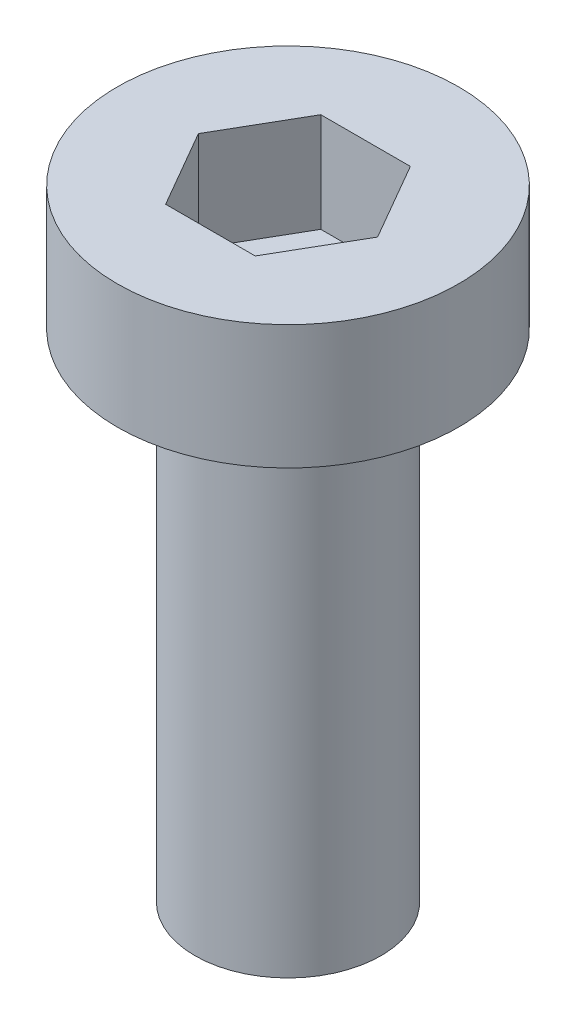
ISO-10303-21;
HEADER;
FILE_DESCRIPTION(('STEP AP214'),'2;1');
FILE_NAME('part.step','',(''),(''),'','','');
FILE_SCHEMA(('AUTOMOTIVE_DESIGN { 1 0 10303 214 1 1 1 1 }'));
ENDSEC;
DATA;
#1=APPLICATION_CONTEXT('core data for automotive mechanical design processes');
#2=APPLICATION_PROTOCOL_DEFINITION('international standard','automotive_design',2000,#1);
#3=PRODUCT_CONTEXT('',#1,'mechanical');
#4=PRODUCT('Part','Part','',(#3));
#5=PRODUCT_RELATED_PRODUCT_CATEGORY('part','',(#4));
#6=PRODUCT_DEFINITION_FORMATION('','',#4);
#7=PRODUCT_DEFINITION_CONTEXT('part definition',#1,'design');
#8=PRODUCT_DEFINITION('design','',#6,#7);
#9=PRODUCT_DEFINITION_SHAPE('','',#8);
#10=(LENGTH_UNIT() NAMED_UNIT(*) SI_UNIT(.MILLI.,.METRE.));
#11=(NAMED_UNIT(*) PLANE_ANGLE_UNIT() SI_UNIT($,.RADIAN.));
#12=(NAMED_UNIT(*) SI_UNIT($,.STERADIAN.) SOLID_ANGLE_UNIT());
#13=UNCERTAINTY_MEASURE_WITH_UNIT(LENGTH_MEASURE(1.E-05),#10,'distance_accuracy_value','');
#14=(GEOMETRIC_REPRESENTATION_CONTEXT(3) GLOBAL_UNCERTAINTY_ASSIGNED_CONTEXT((#13)) GLOBAL_UNIT_ASSIGNED_CONTEXT((#10,
#11,#12)) REPRESENTATION_CONTEXT('',''));
#15=CARTESIAN_POINT('',(0.,0.,0.));
#16=DIRECTION('',(0.,0.,1.));
#17=DIRECTION('',(1.,0.,0.));
#18=AXIS2_PLACEMENT_3D('',#15,#16,#17);
#19=CARTESIAN_POINT('',(0.,2.,0.));
#20=DIRECTION('',(0.,-1.,0.));
#21=DIRECTION('',(0.,0.,-1.));
#22=AXIS2_PLACEMENT_3D('',#19,#20,#21);
#23=CYLINDRICAL_SURFACE('',#22,2.75);
#24=CARTESIAN_POINT('',(0.,2.,0.));
#25=DIRECTION('',(0.,1.,0.));
#26=DIRECTION('',(0.,0.,1.));
#27=AXIS2_PLACEMENT_3D('',#24,#25,#26);
#28=CIRCLE('',#27,2.75);
#29=CARTESIAN_POINT('',(0.,2.,2.75));
#30=VERTEX_POINT('',#29);
#31=EDGE_CURVE('E11',#30,#30,#28,.T.);
#32=ORIENTED_EDGE('',*,*,#31,.F.);
#33=EDGE_LOOP('',(#32));
#34=FACE_BOUND('',#33,.T.);
#35=CARTESIAN_POINT('',(0.,0.,0.));
#36=DIRECTION('',(0.,1.,0.));
#37=DIRECTION('',(0.,0.,1.));
#38=AXIS2_PLACEMENT_3D('',#35,#36,#37);
#39=CIRCLE('',#38,2.75);
#40=CARTESIAN_POINT('',(0.,0.,2.75));
#41=VERTEX_POINT('',#40);
#42=EDGE_CURVE('E41',#41,#41,#39,.T.);
#43=ORIENTED_EDGE('',*,*,#42,.T.);
#44=EDGE_LOOP('',(#43));
#45=FACE_BOUND('',#44,.T.);
#46=ADVANCED_FACE('F38',(#34,#45),#23,.T.);
#47=CARTESIAN_POINT('',(0.,2.,0.));
#48=DIRECTION('',(0.,1.,0.));
#49=DIRECTION('',(0.,0.,1.));
#50=AXIS2_PLACEMENT_3D('',#47,#48,#49);
#51=PLANE('',#50);
#52=DIRECTION('',(0.5,0.,-0.866025403784439));
#53=VECTOR('',#52,1.);
#54=CARTESIAN_POINT('',(0.721687836487033,2.,1.25));
#55=LINE('',#54,#53);
#56=CARTESIAN_POINT('',(0.721687836487033,2.,1.25));
#57=VERTEX_POINT('',#56);
#58=CARTESIAN_POINT('',(1.44337567297406,2.,0.));
#59=VERTEX_POINT('',#58);
#60=EDGE_CURVE('E52',#57,#59,#55,.T.);
#61=ORIENTED_EDGE('',*,*,#60,.F.);
#62=DIRECTION('',(1.,0.,0.));
#63=VECTOR('',#62,1.);
#64=CARTESIAN_POINT('',(-0.721687836487032,2.,1.25));
#65=LINE('',#64,#63);
#66=CARTESIAN_POINT('',(-0.721687836487032,2.,1.25));
#67=VERTEX_POINT('',#66);
#68=EDGE_CURVE('E135',#67,#57,#65,.T.);
#69=ORIENTED_EDGE('',*,*,#68,.F.);
#70=DIRECTION('',(0.5,0.,0.866025403784439));
#71=VECTOR('',#70,1.);
#72=CARTESIAN_POINT('',(-1.44337567297406,2.,0.));
#73=LINE('',#72,#71);
#74=CARTESIAN_POINT('',(-1.44337567297406,2.,0.));
#75=VERTEX_POINT('',#74);
#76=EDGE_CURVE('E133',#75,#67,#73,.T.);
#77=ORIENTED_EDGE('',*,*,#76,.F.);
#78=DIRECTION('',(-0.5,0.,0.866025403784439));
#79=VECTOR('',#78,1.);
#80=CARTESIAN_POINT('',(-0.721687836487032,2.,-1.25));
#81=LINE('',#80,#79);
#82=CARTESIAN_POINT('',(-0.721687836487032,2.,-1.25));
#83=VERTEX_POINT('',#82);
#84=EDGE_CURVE('E100',#83,#75,#81,.T.);
#85=ORIENTED_EDGE('',*,*,#84,.F.);
#86=DIRECTION('',(-1.,0.,0.));
#87=VECTOR('',#86,1.);
#88=CARTESIAN_POINT('',(0.721687836487032,2.,-1.25));
#89=LINE('',#88,#87);
#90=CARTESIAN_POINT('',(0.721687836487032,2.,-1.25));
#91=VERTEX_POINT('',#90);
#92=EDGE_CURVE('E129',#91,#83,#89,.T.);
#93=ORIENTED_EDGE('',*,*,#92,.F.);
#94=DIRECTION('',(-0.5,0.,-0.866025403784438));
#95=VECTOR('',#94,1.);
#96=CARTESIAN_POINT('',(1.44337567297406,2.,0.));
#97=LINE('',#96,#95);
#98=EDGE_CURVE('E126',#59,#91,#97,.T.);
#99=ORIENTED_EDGE('',*,*,#98,.F.);
#100=EDGE_LOOP('',(#61,#69,#77,#85,#93,#99));
#101=FACE_BOUND('',#100,.T.);
#102=ORIENTED_EDGE('',*,*,#31,.T.);
#103=EDGE_LOOP('',(#102));
#104=FACE_BOUND('',#103,.T.);
#105=ADVANCED_FACE('F166',(#101,#104),#51,.T.);
#106=CARTESIAN_POINT('',(0.,0.,0.));
#107=DIRECTION('',(0.,1.,0.));
#108=DIRECTION('',(0.,0.,1.));
#109=AXIS2_PLACEMENT_3D('',#106,#107,#108);
#110=PLANE('',#109);
#111=CARTESIAN_POINT('',(0.,0.,0.));
#112=DIRECTION('',(0.,1.,0.));
#113=DIRECTION('',(0.,0.,1.));
#114=AXIS2_PLACEMENT_3D('',#111,#112,#113);
#115=CIRCLE('',#114,1.5);
#116=CARTESIAN_POINT('',(0.,0.,1.5));
#117=VERTEX_POINT('',#116);
#118=EDGE_CURVE('E139',#117,#117,#115,.T.);
#119=ORIENTED_EDGE('',*,*,#118,.T.);
#120=EDGE_LOOP('',(#119));
#121=FACE_BOUND('',#120,.T.);
#122=ORIENTED_EDGE('',*,*,#42,.F.);
#123=EDGE_LOOP('',(#122));
#124=FACE_BOUND('',#123,.T.);
#125=ADVANCED_FACE('F151',(#121,#124),#110,.F.);
#126=CARTESIAN_POINT('',(0.,-8.,0.));
#127=DIRECTION('',(0.,1.,0.));
#128=DIRECTION('',(0.,0.,1.));
#129=AXIS2_PLACEMENT_3D('',#126,#127,#128);
#130=CYLINDRICAL_SURFACE('',#129,1.5);
#131=CARTESIAN_POINT('',(0.,-8.,0.));
#132=DIRECTION('',(0.,1.,0.));
#133=DIRECTION('',(0.,0.,1.));
#134=AXIS2_PLACEMENT_3D('',#131,#132,#133);
#135=CIRCLE('',#134,1.5);
#136=CARTESIAN_POINT('',(0.,-8.,1.5));
#137=VERTEX_POINT('',#136);
#138=EDGE_CURVE('E145',#137,#137,#135,.T.);
#139=ORIENTED_EDGE('',*,*,#138,.T.);
#140=EDGE_LOOP('',(#139));
#141=FACE_BOUND('',#140,.T.);
#142=ORIENTED_EDGE('',*,*,#118,.F.);
#143=EDGE_LOOP('',(#142));
#144=FACE_BOUND('',#143,.T.);
#145=ADVANCED_FACE('F154',(#141,#144),#130,.T.);
#146=CARTESIAN_POINT('',(0.,-8.,0.));
#147=DIRECTION('',(0.,1.,0.));
#148=DIRECTION('',(0.,0.,1.));
#149=AXIS2_PLACEMENT_3D('',#146,#147,#148);
#150=PLANE('',#149);
#151=ORIENTED_EDGE('',*,*,#138,.F.);
#152=EDGE_LOOP('',(#151));
#153=FACE_BOUND('',#152,.T.);
#154=ADVANCED_FACE('F156',(#153),#150,.F.);
#155=CARTESIAN_POINT('',(0.721687836487033,0.4,1.25));
#156=DIRECTION('',(0.866025403784439,0.,0.5));
#157=DIRECTION('',(0.5,0.,-0.866025403784439));
#158=AXIS2_PLACEMENT_3D('',#155,#156,#157);
#159=PLANE('',#158);
#160=ORIENTED_EDGE('',*,*,#60,.T.);
#161=DIRECTION('',(0.,1.,0.));
#162=VECTOR('',#161,1.);
#163=CARTESIAN_POINT('',(1.44337567297406,0.4,0.));
#164=LINE('',#163,#162);
#165=CARTESIAN_POINT('',(1.44337567297406,0.4,0.));
#166=VERTEX_POINT('',#165);
#167=EDGE_CURVE('E82',#166,#59,#164,.T.);
#168=ORIENTED_EDGE('',*,*,#167,.F.);
#169=DIRECTION('',(0.5,0.,-0.866025403784439));
#170=VECTOR('',#169,1.);
#171=CARTESIAN_POINT('',(0.721687836487033,0.4,1.25));
#172=LINE('',#171,#170);
#173=CARTESIAN_POINT('',(0.721687836487033,0.4,1.25));
#174=VERTEX_POINT('',#173);
#175=EDGE_CURVE('E137',#174,#166,#172,.T.);
#176=ORIENTED_EDGE('',*,*,#175,.F.);
#177=DIRECTION('',(0.,1.,0.));
#178=VECTOR('',#177,1.);
#179=CARTESIAN_POINT('',(0.721687836487033,0.4,1.25));
#180=LINE('',#179,#178);
#181=EDGE_CURVE('E60',#174,#57,#180,.T.);
#182=ORIENTED_EDGE('',*,*,#181,.T.);
#183=EDGE_LOOP('',(#160,#168,#176,#182));
#184=FACE_BOUND('',#183,.T.);
#185=ADVANCED_FACE('F163',(#184),#159,.F.);
#186=CARTESIAN_POINT('',(-0.721687836487032,0.4,1.25));
#187=DIRECTION('',(0.,0.,1.));
#188=DIRECTION('',(1.,0.,0.));
#189=AXIS2_PLACEMENT_3D('',#186,#187,#188);
#190=PLANE('',#189);
#191=ORIENTED_EDGE('',*,*,#68,.T.);
#192=ORIENTED_EDGE('',*,*,#181,.F.);
#193=DIRECTION('',(1.,0.,0.));
#194=VECTOR('',#193,1.);
#195=CARTESIAN_POINT('',(-0.721687836487032,0.4,1.25));
#196=LINE('',#195,#194);
#197=CARTESIAN_POINT('',(-0.721687836487032,0.4,1.25));
#198=VERTEX_POINT('',#197);
#199=EDGE_CURVE('E112',#198,#174,#196,.T.);
#200=ORIENTED_EDGE('',*,*,#199,.F.);
#201=DIRECTION('',(0.,1.,0.));
#202=VECTOR('',#201,1.);
#203=CARTESIAN_POINT('',(-0.721687836487032,0.4,1.25));
#204=LINE('',#203,#202);
#205=EDGE_CURVE('E104',#198,#67,#204,.T.);
#206=ORIENTED_EDGE('',*,*,#205,.T.);
#207=EDGE_LOOP('',(#191,#192,#200,#206));
#208=FACE_BOUND('',#207,.T.);
#209=ADVANCED_FACE('F188',(#208),#190,.F.);
#210=CARTESIAN_POINT('',(-1.44337567297406,0.4,0.));
#211=DIRECTION('',(-0.866025403784439,0.,0.5));
#212=DIRECTION('',(0.5,0.,0.866025403784439));
#213=AXIS2_PLACEMENT_3D('',#210,#211,#212);
#214=PLANE('',#213);
#215=ORIENTED_EDGE('',*,*,#76,.T.);
#216=ORIENTED_EDGE('',*,*,#205,.F.);
#217=DIRECTION('',(0.5,0.,0.866025403784439));
#218=VECTOR('',#217,1.);
#219=CARTESIAN_POINT('',(-1.44337567297406,0.4,0.));
#220=LINE('',#219,#218);
#221=CARTESIAN_POINT('',(-1.44337567297406,0.4,0.));
#222=VERTEX_POINT('',#221);
#223=EDGE_CURVE('E108',#222,#198,#220,.T.);
#224=ORIENTED_EDGE('',*,*,#223,.F.);
#225=DIRECTION('',(0.,1.,0.));
#226=VECTOR('',#225,1.);
#227=CARTESIAN_POINT('',(-1.44337567297406,0.4,0.));
#228=LINE('',#227,#226);
#229=EDGE_CURVE('E93',#222,#75,#228,.T.);
#230=ORIENTED_EDGE('',*,*,#229,.T.);
#231=EDGE_LOOP('',(#215,#216,#224,#230));
#232=FACE_BOUND('',#231,.T.);
#233=ADVANCED_FACE('F109',(#232),#214,.F.);
#234=CARTESIAN_POINT('',(-0.721687836487032,0.4,-1.25));
#235=DIRECTION('',(-0.866025403784439,0.,-0.5));
#236=DIRECTION('',(-0.5,0.,0.866025403784439));
#237=AXIS2_PLACEMENT_3D('',#234,#235,#236);
#238=PLANE('',#237);
#239=ORIENTED_EDGE('',*,*,#84,.T.);
#240=ORIENTED_EDGE('',*,*,#229,.F.);
#241=DIRECTION('',(-0.5,0.,0.866025403784439));
#242=VECTOR('',#241,1.);
#243=CARTESIAN_POINT('',(-0.721687836487032,0.4,-1.25));
#244=LINE('',#243,#242);
#245=CARTESIAN_POINT('',(-0.721687836487032,0.4,-1.25));
#246=VERTEX_POINT('',#245);
#247=EDGE_CURVE('E97',#246,#222,#244,.T.);
#248=ORIENTED_EDGE('',*,*,#247,.F.);
#249=DIRECTION('',(0.,1.,0.));
#250=VECTOR('',#249,1.);
#251=CARTESIAN_POINT('',(-0.721687836487032,0.4,-1.25));
#252=LINE('',#251,#250);
#253=EDGE_CURVE('E105',#246,#83,#252,.T.);
#254=ORIENTED_EDGE('',*,*,#253,.T.);
#255=EDGE_LOOP('',(#239,#240,#248,#254));
#256=FACE_BOUND('',#255,.T.);
#257=ADVANCED_FACE('F95',(#256),#238,.F.);
#258=CARTESIAN_POINT('',(0.721687836487032,0.4,-1.25));
#259=DIRECTION('',(0.,0.,-1.));
#260=DIRECTION('',(-1.,0.,0.));
#261=AXIS2_PLACEMENT_3D('',#258,#259,#260);
#262=PLANE('',#261);
#263=ORIENTED_EDGE('',*,*,#92,.T.);
#264=ORIENTED_EDGE('',*,*,#253,.F.);
#265=DIRECTION('',(-1.,0.,0.));
#266=VECTOR('',#265,1.);
#267=CARTESIAN_POINT('',(0.721687836487032,0.4,-1.25));
#268=LINE('',#267,#266);
#269=CARTESIAN_POINT('',(0.721687836487032,0.4,-1.25));
#270=VERTEX_POINT('',#269);
#271=EDGE_CURVE('E118',#270,#246,#268,.T.);
#272=ORIENTED_EDGE('',*,*,#271,.F.);
#273=DIRECTION('',(0.,1.,0.));
#274=VECTOR('',#273,1.);
#275=CARTESIAN_POINT('',(0.721687836487032,0.4,-1.25));
#276=LINE('',#275,#274);
#277=EDGE_CURVE('E142',#270,#91,#276,.T.);
#278=ORIENTED_EDGE('',*,*,#277,.T.);
#279=EDGE_LOOP('',(#263,#264,#272,#278));
#280=FACE_BOUND('',#279,.T.);
#281=ADVANCED_FACE('F197',(#280),#262,.F.);
#282=CARTESIAN_POINT('',(1.44337567297406,0.4,0.));
#283=DIRECTION('',(0.866025403784438,0.,-0.5));
#284=DIRECTION('',(-0.5,0.,-0.866025403784439));
#285=AXIS2_PLACEMENT_3D('',#282,#283,#284);
#286=PLANE('',#285);
#287=ORIENTED_EDGE('',*,*,#98,.T.);
#288=ORIENTED_EDGE('',*,*,#277,.F.);
#289=DIRECTION('',(-0.5,0.,-0.866025403784438));
#290=VECTOR('',#289,1.);
#291=CARTESIAN_POINT('',(1.44337567297406,0.4,0.));
#292=LINE('',#291,#290);
#293=EDGE_CURVE('E120',#166,#270,#292,.T.);
#294=ORIENTED_EDGE('',*,*,#293,.F.);
#295=ORIENTED_EDGE('',*,*,#167,.T.);
#296=EDGE_LOOP('',(#287,#288,#294,#295));
#297=FACE_BOUND('',#296,.T.);
#298=ADVANCED_FACE('F185',(#297),#286,.F.);
#299=CARTESIAN_POINT('',(0.,0.4,0.));
#300=DIRECTION('',(0.,1.,0.));
#301=DIRECTION('',(0.,0.,1.));
#302=AXIS2_PLACEMENT_3D('',#299,#300,#301);
#303=PLANE('',#302);
#304=ORIENTED_EDGE('',*,*,#175,.T.);
#305=ORIENTED_EDGE('',*,*,#293,.T.);
#306=ORIENTED_EDGE('',*,*,#271,.T.);
#307=ORIENTED_EDGE('',*,*,#247,.T.);
#308=ORIENTED_EDGE('',*,*,#223,.T.);
#309=ORIENTED_EDGE('',*,*,#199,.T.);
#310=EDGE_LOOP('',(#304,#305,#306,#307,#308,#309));
#311=FACE_BOUND('',#310,.T.);
#312=ADVANCED_FACE('F115',(#311),#303,.T.);
#313=CLOSED_SHELL('',(#46,#105,#125,#145,#154,#185,#209,#233,#257,#281,#298,#312));
#314=MANIFOLD_SOLID_BREP('B2',#313);
#315=ADVANCED_BREP_SHAPE_REPRESENTATION('',(#18,#314),#14);
#316=SHAPE_DEFINITION_REPRESENTATION(#9,#315);
ENDSEC;
END-ISO-10303-21;
